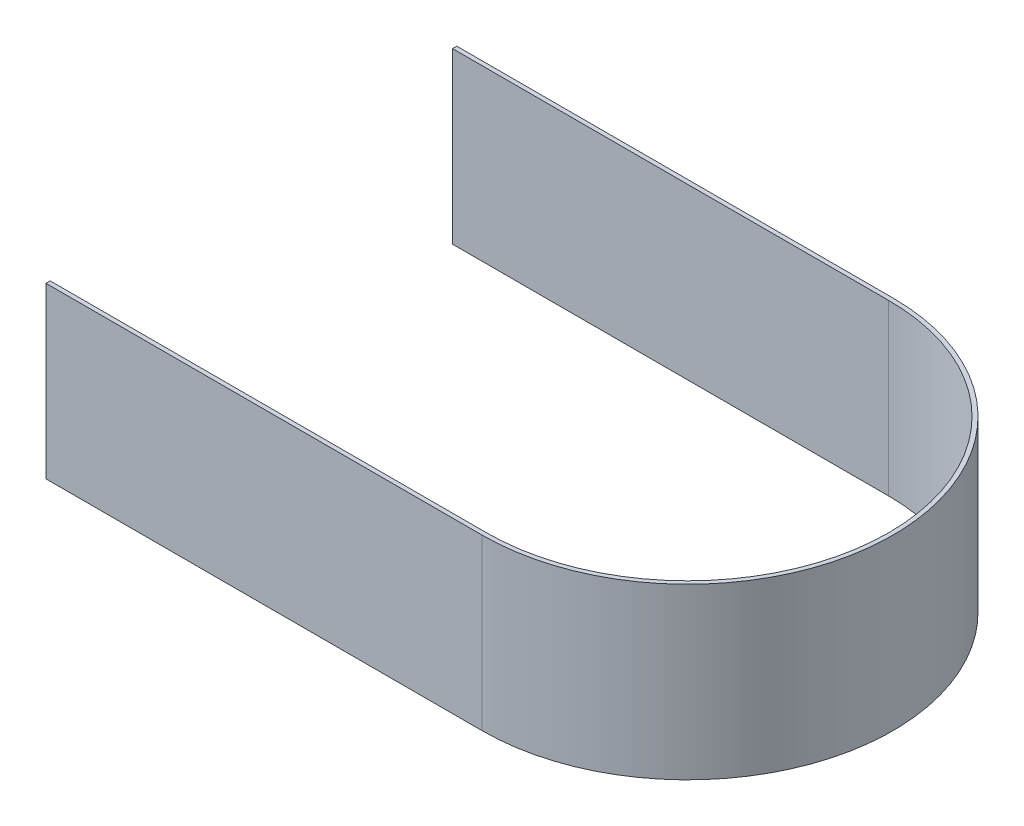
ISO-10303-21;
HEADER;
FILE_DESCRIPTION(('STEP AP214'),'2;1');
FILE_NAME('part.step','',(''),(''),'','','');
FILE_SCHEMA(('AUTOMOTIVE_DESIGN { 1 0 10303 214 1 1 1 1 }'));
ENDSEC;
DATA;
#1=APPLICATION_CONTEXT('core data for automotive mechanical design processes');
#2=APPLICATION_PROTOCOL_DEFINITION('international standard','automotive_design',2000,#1);
#3=PRODUCT_CONTEXT('',#1,'mechanical');
#4=PRODUCT('Part','Part','',(#3));
#5=PRODUCT_RELATED_PRODUCT_CATEGORY('part','',(#4));
#6=PRODUCT_DEFINITION_FORMATION('','',#4);
#7=PRODUCT_DEFINITION_CONTEXT('part definition',#1,'design');
#8=PRODUCT_DEFINITION('design','',#6,#7);
#9=PRODUCT_DEFINITION_SHAPE('','',#8);
#10=(LENGTH_UNIT() NAMED_UNIT(*) SI_UNIT(.MILLI.,.METRE.));
#11=(NAMED_UNIT(*) PLANE_ANGLE_UNIT() SI_UNIT($,.RADIAN.));
#12=(NAMED_UNIT(*) SI_UNIT($,.STERADIAN.) SOLID_ANGLE_UNIT());
#13=UNCERTAINTY_MEASURE_WITH_UNIT(LENGTH_MEASURE(1.E-05),#10,'distance_accuracy_value','');
#14=(GEOMETRIC_REPRESENTATION_CONTEXT(3) GLOBAL_UNCERTAINTY_ASSIGNED_CONTEXT((#13)) GLOBAL_UNIT_ASSIGNED_CONTEXT((#10,
#11,#12)) REPRESENTATION_CONTEXT('',''));
#15=CARTESIAN_POINT('',(0.,0.,0.));
#16=DIRECTION('',(0.,0.,1.));
#17=DIRECTION('',(1.,0.,0.));
#18=AXIS2_PLACEMENT_3D('',#15,#16,#17);
#19=CARTESIAN_POINT('',(0.,4.,0.));
#20=DIRECTION('',(1.,0.,0.));
#21=DIRECTION('',(0.,0.,-1.));
#22=AXIS2_PLACEMENT_3D('',#19,#20,#21);
#23=PLANE('',#22);
#24=DIRECTION('',(0.,0.,1.));
#25=VECTOR('',#24,1.);
#26=CARTESIAN_POINT('',(0.,0.,0.));
#27=LINE('',#26,#25);
#28=CARTESIAN_POINT('',(0.,0.,0.));
#29=VERTEX_POINT('',#28);
#30=CARTESIAN_POINT('',(0.,0.,0.1));
#31=VERTEX_POINT('',#30);
#32=EDGE_CURVE('E133',#29,#31,#27,.T.);
#33=ORIENTED_EDGE('',*,*,#32,.T.);
#34=DIRECTION('',(0.,-1.,0.));
#35=VECTOR('',#34,1.);
#36=CARTESIAN_POINT('',(0.,4.,0.1));
#37=LINE('',#36,#35);
#38=CARTESIAN_POINT('',(0.,4.,0.1));
#39=VERTEX_POINT('',#38);
#40=EDGE_CURVE('E11',#39,#31,#37,.T.);
#41=ORIENTED_EDGE('',*,*,#40,.F.);
#42=DIRECTION('',(0.,0.,1.));
#43=VECTOR('',#42,1.);
#44=CARTESIAN_POINT('',(0.,4.,0.));
#45=LINE('',#44,#43);
#46=CARTESIAN_POINT('',(0.,4.,0.));
#47=VERTEX_POINT('',#46);
#48=EDGE_CURVE('E147',#47,#39,#45,.T.);
#49=ORIENTED_EDGE('',*,*,#48,.F.);
#50=DIRECTION('',(0.,-1.,0.));
#51=VECTOR('',#50,1.);
#52=CARTESIAN_POINT('',(0.,4.,0.));
#53=LINE('',#52,#51);
#54=EDGE_CURVE('E129',#47,#29,#53,.T.);
#55=ORIENTED_EDGE('',*,*,#54,.T.);
#56=EDGE_LOOP('',(#33,#41,#49,#55));
#57=FACE_BOUND('',#56,.T.);
#58=ADVANCED_FACE('F37',(#57),#23,.F.);
#59=CARTESIAN_POINT('',(0.,4.,0.1));
#60=DIRECTION('',(0.,0.,-1.));
#61=DIRECTION('',(-1.,0.,0.));
#62=AXIS2_PLACEMENT_3D('',#59,#60,#61);
#63=PLANE('',#62);
#64=DIRECTION('',(1.,0.,0.));
#65=VECTOR('',#64,1.);
#66=CARTESIAN_POINT('',(0.,0.,0.1));
#67=LINE('',#66,#65);
#68=CARTESIAN_POINT('',(10.3,0.,0.0999999999999994));
#69=VERTEX_POINT('',#68);
#70=EDGE_CURVE('E136',#31,#69,#67,.T.);
#71=ORIENTED_EDGE('',*,*,#70,.T.);
#72=DIRECTION('',(0.,-1.,0.));
#73=VECTOR('',#72,1.);
#74=CARTESIAN_POINT('',(10.3,4.,0.0999999999999994));
#75=LINE('',#74,#73);
#76=CARTESIAN_POINT('',(10.3,4.,0.0999999999999994));
#77=VERTEX_POINT('',#76);
#78=EDGE_CURVE('E45',#77,#69,#75,.T.);
#79=ORIENTED_EDGE('',*,*,#78,.F.);
#80=DIRECTION('',(1.,0.,0.));
#81=VECTOR('',#80,1.);
#82=CARTESIAN_POINT('',(0.,4.,0.1));
#83=LINE('',#82,#81);
#84=EDGE_CURVE('E96',#39,#77,#83,.T.);
#85=ORIENTED_EDGE('',*,*,#84,.F.);
#86=ORIENTED_EDGE('',*,*,#40,.T.);
#87=EDGE_LOOP('',(#71,#79,#85,#86));
#88=FACE_BOUND('',#87,.T.);
#89=ADVANCED_FACE('F182',(#88),#63,.F.);
#90=CARTESIAN_POINT('',(10.3,4.,-4.75));
#91=DIRECTION('',(0.,-1.,0.));
#92=DIRECTION('',(0.,0.,-1.));
#93=AXIS2_PLACEMENT_3D('',#90,#91,#92);
#94=CYLINDRICAL_SURFACE('',#93,4.85);
#95=CARTESIAN_POINT('',(10.3,0.,-4.75));
#96=DIRECTION('',(0.,1.,0.));
#97=DIRECTION('',(0.,0.,1.));
#98=AXIS2_PLACEMENT_3D('',#95,#96,#97);
#99=CIRCLE('',#98,4.85);
#100=CARTESIAN_POINT('',(10.3,0.,-9.6));
#101=VERTEX_POINT('',#100);
#102=EDGE_CURVE('E138',#69,#101,#99,.T.);
#103=ORIENTED_EDGE('',*,*,#102,.T.);
#104=DIRECTION('',(0.,-1.,0.));
#105=VECTOR('',#104,1.);
#106=CARTESIAN_POINT('',(10.3,4.,-9.6));
#107=LINE('',#106,#105);
#108=CARTESIAN_POINT('',(10.3,4.,-9.6));
#109=VERTEX_POINT('',#108);
#110=EDGE_CURVE('E154',#109,#101,#107,.T.);
#111=ORIENTED_EDGE('',*,*,#110,.F.);
#112=CARTESIAN_POINT('',(10.3,4.,-4.75));
#113=DIRECTION('',(0.,1.,0.));
#114=DIRECTION('',(0.,0.,1.));
#115=AXIS2_PLACEMENT_3D('',#112,#113,#114);
#116=CIRCLE('',#115,4.85);
#117=EDGE_CURVE('E162',#77,#109,#116,.T.);
#118=ORIENTED_EDGE('',*,*,#117,.F.);
#119=ORIENTED_EDGE('',*,*,#78,.T.);
#120=EDGE_LOOP('',(#103,#111,#118,#119));
#121=FACE_BOUND('',#120,.T.);
#122=ADVANCED_FACE('F160',(#121),#94,.T.);
#123=CARTESIAN_POINT('',(10.3,4.,-9.6));
#124=DIRECTION('',(0.,0.,1.));
#125=DIRECTION('',(1.,0.,0.));
#126=AXIS2_PLACEMENT_3D('',#123,#124,#125);
#127=PLANE('',#126);
#128=DIRECTION('',(-1.,0.,0.));
#129=VECTOR('',#128,1.);
#130=CARTESIAN_POINT('',(10.3,0.,-9.6));
#131=LINE('',#130,#129);
#132=CARTESIAN_POINT('',(0.,0.,-9.6));
#133=VERTEX_POINT('',#132);
#134=EDGE_CURVE('E140',#101,#133,#131,.T.);
#135=ORIENTED_EDGE('',*,*,#134,.T.);
#136=DIRECTION('',(0.,-1.,0.));
#137=VECTOR('',#136,1.);
#138=CARTESIAN_POINT('',(0.,4.,-9.6));
#139=LINE('',#138,#137);
#140=CARTESIAN_POINT('',(0.,4.,-9.6));
#141=VERTEX_POINT('',#140);
#142=EDGE_CURVE('E151',#141,#133,#139,.T.);
#143=ORIENTED_EDGE('',*,*,#142,.F.);
#144=DIRECTION('',(-1.,0.,0.));
#145=VECTOR('',#144,1.);
#146=CARTESIAN_POINT('',(10.3,4.,-9.6));
#147=LINE('',#146,#145);
#148=EDGE_CURVE('E174',#109,#141,#147,.T.);
#149=ORIENTED_EDGE('',*,*,#148,.F.);
#150=ORIENTED_EDGE('',*,*,#110,.T.);
#151=EDGE_LOOP('',(#135,#143,#149,#150));
#152=FACE_BOUND('',#151,.T.);
#153=ADVANCED_FACE('F170',(#152),#127,.F.);
#154=CARTESIAN_POINT('',(0.,4.,-9.6));
#155=DIRECTION('',(1.,0.,0.));
#156=DIRECTION('',(0.,0.,-1.));
#157=AXIS2_PLACEMENT_3D('',#154,#155,#156);
#158=PLANE('',#157);
#159=DIRECTION('',(0.,0.,1.));
#160=VECTOR('',#159,1.);
#161=CARTESIAN_POINT('',(0.,0.,-9.6));
#162=LINE('',#161,#160);
#163=CARTESIAN_POINT('',(0.,0.,-9.5));
#164=VERTEX_POINT('',#163);
#165=EDGE_CURVE('E142',#133,#164,#162,.T.);
#166=ORIENTED_EDGE('',*,*,#165,.T.);
#167=DIRECTION('',(0.,-1.,0.));
#168=VECTOR('',#167,1.);
#169=CARTESIAN_POINT('',(0.,4.,-9.5));
#170=LINE('',#169,#168);
#171=CARTESIAN_POINT('',(0.,4.,-9.5));
#172=VERTEX_POINT('',#171);
#173=EDGE_CURVE('E124',#172,#164,#170,.T.);
#174=ORIENTED_EDGE('',*,*,#173,.F.);
#175=DIRECTION('',(0.,0.,1.));
#176=VECTOR('',#175,1.);
#177=CARTESIAN_POINT('',(0.,4.,-9.6));
#178=LINE('',#177,#176);
#179=EDGE_CURVE('E115',#141,#172,#178,.T.);
#180=ORIENTED_EDGE('',*,*,#179,.F.);
#181=ORIENTED_EDGE('',*,*,#142,.T.);
#182=EDGE_LOOP('',(#166,#174,#180,#181));
#183=FACE_BOUND('',#182,.T.);
#184=ADVANCED_FACE('F173',(#183),#158,.F.);
#185=CARTESIAN_POINT('',(10.3,4.,-9.5));
#186=DIRECTION('',(0.,0.,-1.));
#187=DIRECTION('',(-1.,0.,0.));
#188=AXIS2_PLACEMENT_3D('',#185,#186,#187);
#189=PLANE('',#188);
#190=DIRECTION('',(1.,0.,0.));
#191=VECTOR('',#190,1.);
#192=CARTESIAN_POINT('',(10.3,0.,-9.5));
#193=LINE('',#192,#191);
#194=CARTESIAN_POINT('',(10.3,0.,-9.5));
#195=VERTEX_POINT('',#194);
#196=EDGE_CURVE('E123',#164,#195,#193,.T.);
#197=ORIENTED_EDGE('',*,*,#196,.T.);
#198=DIRECTION('',(0.,-1.,0.));
#199=VECTOR('',#198,1.);
#200=CARTESIAN_POINT('',(10.3,4.,-9.5));
#201=LINE('',#200,#199);
#202=CARTESIAN_POINT('',(10.3,4.,-9.5));
#203=VERTEX_POINT('',#202);
#204=EDGE_CURVE('E120',#203,#195,#201,.T.);
#205=ORIENTED_EDGE('',*,*,#204,.F.);
#206=DIRECTION('',(1.,0.,0.));
#207=VECTOR('',#206,1.);
#208=CARTESIAN_POINT('',(10.3,4.,-9.5));
#209=LINE('',#208,#207);
#210=EDGE_CURVE('E109',#172,#203,#209,.T.);
#211=ORIENTED_EDGE('',*,*,#210,.F.);
#212=ORIENTED_EDGE('',*,*,#173,.T.);
#213=EDGE_LOOP('',(#197,#205,#211,#212));
#214=FACE_BOUND('',#213,.T.);
#215=ADVANCED_FACE('F121',(#214),#189,.F.);
#216=CARTESIAN_POINT('',(10.3,4.,-4.75));
#217=DIRECTION('',(0.,-1.,0.));
#218=DIRECTION('',(0.,0.,-1.));
#219=AXIS2_PLACEMENT_3D('',#216,#217,#218);
#220=CYLINDRICAL_SURFACE('',#219,4.75);
#221=CARTESIAN_POINT('',(10.3,0.,-4.75));
#222=DIRECTION('',(0.,-1.,0.));
#223=DIRECTION('',(0.,0.,1.));
#224=AXIS2_PLACEMENT_3D('',#221,#222,#223);
#225=CIRCLE('',#224,4.75);
#226=CARTESIAN_POINT('',(10.3,0.,0.));
#227=VERTEX_POINT('',#226);
#228=EDGE_CURVE('E82',#195,#227,#225,.T.);
#229=ORIENTED_EDGE('',*,*,#228,.T.);
#230=DIRECTION('',(0.,-1.,0.));
#231=VECTOR('',#230,1.);
#232=CARTESIAN_POINT('',(10.3,4.,0.));
#233=LINE('',#232,#231);
#234=CARTESIAN_POINT('',(10.3,4.,0.));
#235=VERTEX_POINT('',#234);
#236=EDGE_CURVE('E125',#235,#227,#233,.T.);
#237=ORIENTED_EDGE('',*,*,#236,.F.);
#238=CARTESIAN_POINT('',(10.3,4.,-4.75));
#239=DIRECTION('',(0.,-1.,0.));
#240=DIRECTION('',(0.,0.,1.));
#241=AXIS2_PLACEMENT_3D('',#238,#239,#240);
#242=CIRCLE('',#241,4.75);
#243=EDGE_CURVE('E113',#203,#235,#242,.T.);
#244=ORIENTED_EDGE('',*,*,#243,.F.);
#245=ORIENTED_EDGE('',*,*,#204,.T.);
#246=EDGE_LOOP('',(#229,#237,#244,#245));
#247=FACE_BOUND('',#246,.T.);
#248=ADVANCED_FACE('F127',(#247),#220,.F.);
#249=CARTESIAN_POINT('',(0.,4.,0.));
#250=DIRECTION('',(0.,0.,1.));
#251=DIRECTION('',(1.,0.,0.));
#252=AXIS2_PLACEMENT_3D('',#249,#250,#251);
#253=PLANE('',#252);
#254=DIRECTION('',(-1.,0.,0.));
#255=VECTOR('',#254,1.);
#256=CARTESIAN_POINT('',(0.,0.,0.));
#257=LINE('',#256,#255);
#258=EDGE_CURVE('E88',#227,#29,#257,.T.);
#259=ORIENTED_EDGE('',*,*,#258,.T.);
#260=ORIENTED_EDGE('',*,*,#54,.F.);
#261=DIRECTION('',(-1.,0.,0.));
#262=VECTOR('',#261,1.);
#263=CARTESIAN_POINT('',(0.,4.,0.));
#264=LINE('',#263,#262);
#265=EDGE_CURVE('E53',#235,#47,#264,.T.);
#266=ORIENTED_EDGE('',*,*,#265,.F.);
#267=ORIENTED_EDGE('',*,*,#236,.T.);
#268=EDGE_LOOP('',(#259,#260,#266,#267));
#269=FACE_BOUND('',#268,.T.);
#270=ADVANCED_FACE('F198',(#269),#253,.F.);
#271=CARTESIAN_POINT('',(10.3,4.,-4.75));
#272=DIRECTION('',(0.,1.,0.));
#273=DIRECTION('',(0.,0.,1.));
#274=AXIS2_PLACEMENT_3D('',#271,#272,#273);
#275=PLANE('',#274);
#276=ORIENTED_EDGE('',*,*,#48,.T.);
#277=ORIENTED_EDGE('',*,*,#84,.T.);
#278=ORIENTED_EDGE('',*,*,#117,.T.);
#279=ORIENTED_EDGE('',*,*,#148,.T.);
#280=ORIENTED_EDGE('',*,*,#179,.T.);
#281=ORIENTED_EDGE('',*,*,#210,.T.);
#282=ORIENTED_EDGE('',*,*,#243,.T.);
#283=ORIENTED_EDGE('',*,*,#265,.T.);
#284=EDGE_LOOP('',(#276,#277,#278,#279,#280,#281,#282,#283));
#285=FACE_BOUND('',#284,.T.);
#286=ADVANCED_FACE('F111',(#285),#275,.T.);
#287=CARTESIAN_POINT('',(10.3,0.,-4.75));
#288=DIRECTION('',(0.,1.,0.));
#289=DIRECTION('',(0.,0.,1.));
#290=AXIS2_PLACEMENT_3D('',#287,#288,#289);
#291=PLANE('',#290);
#292=ORIENTED_EDGE('',*,*,#32,.F.);
#293=ORIENTED_EDGE('',*,*,#258,.F.);
#294=ORIENTED_EDGE('',*,*,#228,.F.);
#295=ORIENTED_EDGE('',*,*,#196,.F.);
#296=ORIENTED_EDGE('',*,*,#165,.F.);
#297=ORIENTED_EDGE('',*,*,#134,.F.);
#298=ORIENTED_EDGE('',*,*,#102,.F.);
#299=ORIENTED_EDGE('',*,*,#70,.F.);
#300=EDGE_LOOP('',(#292,#293,#294,#295,#296,#297,#298,#299));
#301=FACE_BOUND('',#300,.T.);
#302=ADVANCED_FACE('F166',(#301),#291,.F.);
#303=CLOSED_SHELL('',(#58,#89,#122,#153,#184,#215,#248,#270,#286,#302));
#304=MANIFOLD_SOLID_BREP('B2',#303);
#305=ADVANCED_BREP_SHAPE_REPRESENTATION('',(#18,#304),#14);
#306=SHAPE_DEFINITION_REPRESENTATION(#9,#305);
ENDSEC;
END-ISO-10303-21;
